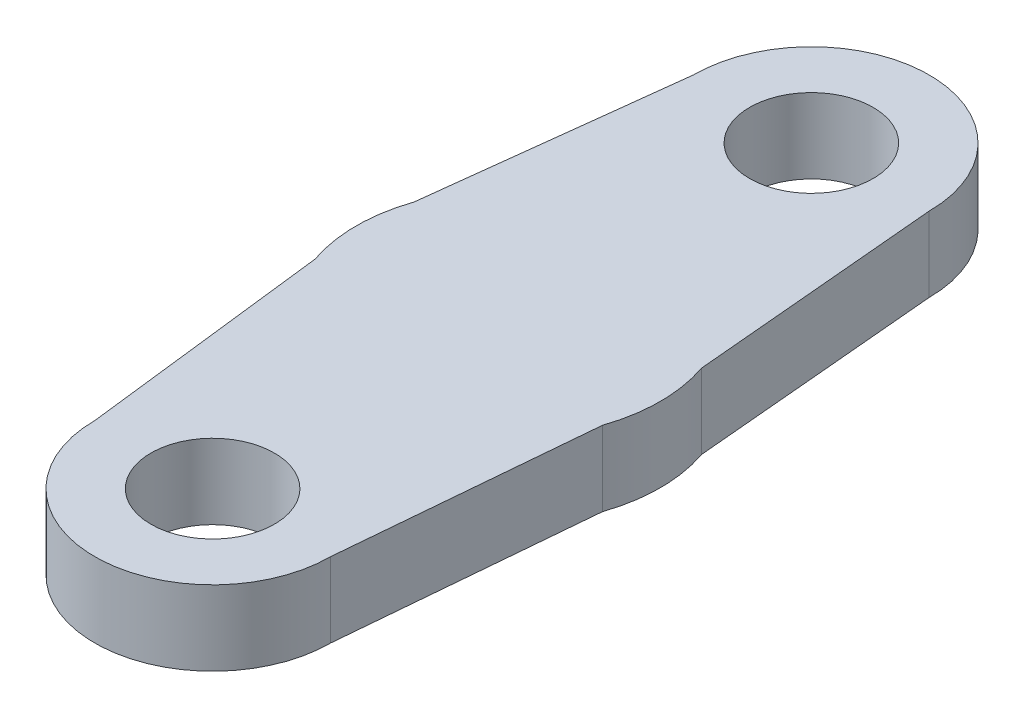
ISO-10303-21;
HEADER;
FILE_DESCRIPTION(('STEP AP214'),'2;1');
FILE_NAME('part.step','',(''),(''),'','','');
FILE_SCHEMA(('AUTOMOTIVE_DESIGN { 1 0 10303 214 1 1 1 1 }'));
ENDSEC;
DATA;
#1=APPLICATION_CONTEXT('core data for automotive mechanical design processes');
#2=APPLICATION_PROTOCOL_DEFINITION('international standard','automotive_design',2000,#1);
#3=PRODUCT_CONTEXT('',#1,'mechanical');
#4=PRODUCT('Part','Part','',(#3));
#5=PRODUCT_RELATED_PRODUCT_CATEGORY('part','',(#4));
#6=PRODUCT_DEFINITION_FORMATION('','',#4);
#7=PRODUCT_DEFINITION_CONTEXT('part definition',#1,'design');
#8=PRODUCT_DEFINITION('design','',#6,#7);
#9=PRODUCT_DEFINITION_SHAPE('','',#8);
#10=(LENGTH_UNIT() NAMED_UNIT(*) SI_UNIT(.MILLI.,.METRE.));
#11=(NAMED_UNIT(*) PLANE_ANGLE_UNIT() SI_UNIT($,.RADIAN.));
#12=(NAMED_UNIT(*) SI_UNIT($,.STERADIAN.) SOLID_ANGLE_UNIT());
#13=UNCERTAINTY_MEASURE_WITH_UNIT(LENGTH_MEASURE(1.E-05),#10,'distance_accuracy_value','');
#14=(GEOMETRIC_REPRESENTATION_CONTEXT(3) GLOBAL_UNCERTAINTY_ASSIGNED_CONTEXT((#13)) GLOBAL_UNIT_ASSIGNED_CONTEXT((#10,
#11,#12)) REPRESENTATION_CONTEXT('',''));
#15=CARTESIAN_POINT('',(0.,0.,0.));
#16=DIRECTION('',(0.,0.,1.));
#17=DIRECTION('',(1.,0.,0.));
#18=AXIS2_PLACEMENT_3D('',#15,#16,#17);
#19=CARTESIAN_POINT('',(0.,2.,0.));
#20=DIRECTION('',(0.,1.,0.));
#21=DIRECTION('',(0.,0.,1.));
#22=AXIS2_PLACEMENT_3D('',#19,#20,#21);
#23=PLANE('',#22);
#24=CARTESIAN_POINT('',(0.0999999999999985,2.,-8.00000000000001));
#25=DIRECTION('',(0.,1.,0.));
#26=DIRECTION('',(0.,0.,1.));
#27=AXIS2_PLACEMENT_3D('',#24,#25,#26);
#28=CIRCLE('',#27,1.65);
#29=CARTESIAN_POINT('',(0.0999999999999985,2.,-6.35000000000001));
#30=VERTEX_POINT('',#29);
#31=EDGE_CURVE('E134',#30,#30,#28,.T.);
#32=ORIENTED_EDGE('',*,*,#31,.F.);
#33=EDGE_LOOP('',(#32));
#34=FACE_BOUND('',#33,.T.);
#35=CARTESIAN_POINT('',(0.,2.,0.));
#36=DIRECTION('',(0.,1.,0.));
#37=DIRECTION('',(0.,0.,1.));
#38=AXIS2_PLACEMENT_3D('',#35,#36,#37);
#39=CIRCLE('',#38,4.06381800776111);
#40=CARTESIAN_POINT('',(3.84313688150053,2.,1.32095257683761));
#41=VERTEX_POINT('',#40);
#42=CARTESIAN_POINT('',(3.84313688150052,2.,-1.32095257683762));
#43=VERTEX_POINT('',#42);
#44=EDGE_CURVE('E145',#41,#43,#39,.T.);
#45=ORIENTED_EDGE('',*,*,#44,.T.);
#46=DIRECTION('',(-0.0884574879667481,0.,-0.996079953027172));
#47=VECTOR('',#46,1.);
#48=CARTESIAN_POINT('',(3.25,2.,-8.00000000000001));
#49=LINE('',#48,#47);
#50=CARTESIAN_POINT('',(3.25,2.,-8.00000000000001));
#51=VERTEX_POINT('',#50);
#52=EDGE_CURVE('E93',#43,#51,#49,.T.);
#53=ORIENTED_EDGE('',*,*,#52,.T.);
#54=CARTESIAN_POINT('',(0.0999999999999985,2.,-8.00000000000001));
#55=DIRECTION('',(0.,1.,0.));
#56=DIRECTION('',(0.,0.,1.));
#57=AXIS2_PLACEMENT_3D('',#54,#55,#56);
#58=CIRCLE('',#57,3.15);
#59=CARTESIAN_POINT('',(-3.05,2.,-8.00000000000001));
#60=VERTEX_POINT('',#59);
#61=EDGE_CURVE('E160',#51,#60,#58,.T.);
#62=ORIENTED_EDGE('',*,*,#61,.T.);
#63=DIRECTION('',(-0.117921472154174,0.,0.99302292340358));
#64=VECTOR('',#63,1.);
#65=CARTESIAN_POINT('',(-3.05,2.,-8.00000000000001));
#66=LINE('',#65,#64);
#67=CARTESIAN_POINT('',(-3.84313688150053,2.,-1.32095257683761));
#68=VERTEX_POINT('',#67);
#69=EDGE_CURVE('E173',#60,#68,#66,.T.);
#70=ORIENTED_EDGE('',*,*,#69,.T.);
#71=CARTESIAN_POINT('',(0.,2.,0.));
#72=DIRECTION('',(0.,1.,0.));
#73=DIRECTION('',(0.,0.,1.));
#74=AXIS2_PLACEMENT_3D('',#71,#72,#73);
#75=CIRCLE('',#74,4.06381800776111);
#76=CARTESIAN_POINT('',(-3.84313688150052,2.,1.32095257683761));
#77=VERTEX_POINT('',#76);
#78=EDGE_CURVE('E112',#68,#77,#75,.T.);
#79=ORIENTED_EDGE('',*,*,#78,.T.);
#80=DIRECTION('',(0.117921472154174,0.,0.99302292340358));
#81=VECTOR('',#80,1.);
#82=CARTESIAN_POINT('',(-3.84313688150052,2.,1.32095257683761));
#83=LINE('',#82,#81);
#84=CARTESIAN_POINT('',(-3.05,2.,8.00000000000001));
#85=VERTEX_POINT('',#84);
#86=EDGE_CURVE('E106',#77,#85,#83,.T.);
#87=ORIENTED_EDGE('',*,*,#86,.T.);
#88=CARTESIAN_POINT('',(0.0999999999999985,2.,8.00000000000001));
#89=DIRECTION('',(0.,1.,0.));
#90=DIRECTION('',(0.,0.,1.));
#91=AXIS2_PLACEMENT_3D('',#88,#89,#90);
#92=CIRCLE('',#91,3.15);
#93=CARTESIAN_POINT('',(3.25,2.,8.00000000000001));
#94=VERTEX_POINT('',#93);
#95=EDGE_CURVE('E110',#85,#94,#92,.T.);
#96=ORIENTED_EDGE('',*,*,#95,.T.);
#97=DIRECTION('',(0.0884574879667482,0.,-0.996079953027172));
#98=VECTOR('',#97,1.);
#99=CARTESIAN_POINT('',(3.84313688150053,2.,1.32095257683761));
#100=LINE('',#99,#98);
#101=EDGE_CURVE('E50',#94,#41,#100,.T.);
#102=ORIENTED_EDGE('',*,*,#101,.T.);
#103=EDGE_LOOP('',(#45,#53,#62,#70,#79,#87,#96,#102));
#104=FACE_BOUND('',#103,.T.);
#105=CARTESIAN_POINT('',(0.0999999999999985,2.,8.00000000000001));
#106=DIRECTION('',(0.,1.,0.));
#107=DIRECTION('',(0.,0.,1.));
#108=AXIS2_PLACEMENT_3D('',#105,#106,#107);
#109=CIRCLE('',#108,1.65);
#110=CARTESIAN_POINT('',(0.0999999999999985,2.,9.65000000000001));
#111=VERTEX_POINT('',#110);
#112=EDGE_CURVE('E182',#111,#111,#109,.T.);
#113=ORIENTED_EDGE('',*,*,#112,.F.);
#114=EDGE_LOOP('',(#113));
#115=FACE_BOUND('',#114,.T.);
#116=ADVANCED_FACE('F33',(#34,#104,#115),#23,.T.);
#117=CARTESIAN_POINT('',(0.,0.,0.));
#118=DIRECTION('',(0.,1.,0.));
#119=DIRECTION('',(0.,0.,1.));
#120=AXIS2_PLACEMENT_3D('',#117,#118,#119);
#121=PLANE('',#120);
#122=CARTESIAN_POINT('',(0.,0.,0.));
#123=DIRECTION('',(0.,1.,0.));
#124=DIRECTION('',(0.,0.,1.));
#125=AXIS2_PLACEMENT_3D('',#122,#123,#124);
#126=CIRCLE('',#125,4.06381800776111);
#127=CARTESIAN_POINT('',(3.84313688150053,0.,1.32095257683761));
#128=VERTEX_POINT('',#127);
#129=CARTESIAN_POINT('',(3.84313688150052,0.,-1.32095257683762));
#130=VERTEX_POINT('',#129);
#131=EDGE_CURVE('E130',#128,#130,#126,.T.);
#132=ORIENTED_EDGE('',*,*,#131,.F.);
#133=DIRECTION('',(0.0884574879667482,0.,-0.996079953027172));
#134=VECTOR('',#133,1.);
#135=CARTESIAN_POINT('',(3.84313688150053,0.,1.32095257683761));
#136=LINE('',#135,#134);
#137=CARTESIAN_POINT('',(3.25,0.,8.00000000000001));
#138=VERTEX_POINT('',#137);
#139=EDGE_CURVE('E85',#138,#128,#136,.T.);
#140=ORIENTED_EDGE('',*,*,#139,.F.);
#141=CARTESIAN_POINT('',(0.0999999999999985,0.,8.00000000000001));
#142=DIRECTION('',(0.,1.,0.));
#143=DIRECTION('',(0.,0.,1.));
#144=AXIS2_PLACEMENT_3D('',#141,#142,#143);
#145=CIRCLE('',#144,3.15);
#146=CARTESIAN_POINT('',(-3.05,0.,8.00000000000001));
#147=VERTEX_POINT('',#146);
#148=EDGE_CURVE('E79',#147,#138,#145,.T.);
#149=ORIENTED_EDGE('',*,*,#148,.F.);
#150=DIRECTION('',(0.117921472154174,0.,0.99302292340358));
#151=VECTOR('',#150,1.);
#152=CARTESIAN_POINT('',(-3.84313688150052,0.,1.32095257683761));
#153=LINE('',#152,#151);
#154=CARTESIAN_POINT('',(-3.84313688150052,0.,1.32095257683761));
#155=VERTEX_POINT('',#154);
#156=EDGE_CURVE('E120',#155,#147,#153,.T.);
#157=ORIENTED_EDGE('',*,*,#156,.F.);
#158=CARTESIAN_POINT('',(0.,0.,0.));
#159=DIRECTION('',(0.,1.,0.));
#160=DIRECTION('',(0.,0.,1.));
#161=AXIS2_PLACEMENT_3D('',#158,#159,#160);
#162=CIRCLE('',#161,4.06381800776111);
#163=CARTESIAN_POINT('',(-3.84313688150053,0.,-1.32095257683761));
#164=VERTEX_POINT('',#163);
#165=EDGE_CURVE('E140',#164,#155,#162,.T.);
#166=ORIENTED_EDGE('',*,*,#165,.F.);
#167=DIRECTION('',(-0.117921472154174,0.,0.99302292340358));
#168=VECTOR('',#167,1.);
#169=CARTESIAN_POINT('',(-3.05,0.,-8.00000000000001));
#170=LINE('',#169,#168);
#171=CARTESIAN_POINT('',(-3.05,0.,-8.00000000000001));
#172=VERTEX_POINT('',#171);
#173=EDGE_CURVE('E138',#172,#164,#170,.T.);
#174=ORIENTED_EDGE('',*,*,#173,.F.);
#175=CARTESIAN_POINT('',(0.0999999999999985,0.,-8.00000000000001));
#176=DIRECTION('',(0.,1.,0.));
#177=DIRECTION('',(0.,0.,1.));
#178=AXIS2_PLACEMENT_3D('',#175,#176,#177);
#179=CIRCLE('',#178,3.15);
#180=CARTESIAN_POINT('',(3.25,0.,-8.00000000000001));
#181=VERTEX_POINT('',#180);
#182=EDGE_CURVE('E136',#181,#172,#179,.T.);
#183=ORIENTED_EDGE('',*,*,#182,.F.);
#184=DIRECTION('',(-0.0884574879667481,0.,-0.996079953027172));
#185=VECTOR('',#184,1.);
#186=CARTESIAN_POINT('',(3.25,0.,-8.00000000000001));
#187=LINE('',#186,#185);
#188=EDGE_CURVE('E133',#130,#181,#187,.T.);
#189=ORIENTED_EDGE('',*,*,#188,.F.);
#190=EDGE_LOOP('',(#132,#140,#149,#157,#166,#174,#183,#189));
#191=FACE_BOUND('',#190,.T.);
#192=CARTESIAN_POINT('',(0.0999999999999985,0.,-8.00000000000001));
#193=DIRECTION('',(0.,1.,0.));
#194=DIRECTION('',(0.,0.,1.));
#195=AXIS2_PLACEMENT_3D('',#192,#193,#194);
#196=CIRCLE('',#195,1.65);
#197=CARTESIAN_POINT('',(0.0999999999999985,0.,-6.35000000000001));
#198=VERTEX_POINT('',#197);
#199=EDGE_CURVE('E179',#198,#198,#196,.T.);
#200=ORIENTED_EDGE('',*,*,#199,.T.);
#201=EDGE_LOOP('',(#200));
#202=FACE_BOUND('',#201,.T.);
#203=CARTESIAN_POINT('',(0.0999999999999985,0.,8.00000000000001));
#204=DIRECTION('',(0.,1.,0.));
#205=DIRECTION('',(0.,0.,1.));
#206=AXIS2_PLACEMENT_3D('',#203,#204,#205);
#207=CIRCLE('',#206,1.65);
#208=CARTESIAN_POINT('',(0.0999999999999985,0.,9.65000000000001));
#209=VERTEX_POINT('',#208);
#210=EDGE_CURVE('E185',#209,#209,#207,.T.);
#211=ORIENTED_EDGE('',*,*,#210,.T.);
#212=EDGE_LOOP('',(#211));
#213=FACE_BOUND('',#212,.T.);
#214=ADVANCED_FACE('F164',(#191,#202,#213),#121,.F.);
#215=CARTESIAN_POINT('',(0.,2.,0.));
#216=DIRECTION('',(0.,-1.,0.));
#217=DIRECTION('',(0.,0.,-1.));
#218=AXIS2_PLACEMENT_3D('',#215,#216,#217);
#219=CYLINDRICAL_SURFACE('',#218,4.06381800776111);
#220=ORIENTED_EDGE('',*,*,#131,.T.);
#221=DIRECTION('',(0.,-1.,0.));
#222=VECTOR('',#221,1.);
#223=CARTESIAN_POINT('',(3.84313688150052,2.,-1.32095257683762));
#224=LINE('',#223,#222);
#225=EDGE_CURVE('E11',#43,#130,#224,.T.);
#226=ORIENTED_EDGE('',*,*,#225,.F.);
#227=ORIENTED_EDGE('',*,*,#44,.F.);
#228=DIRECTION('',(0.,-1.,0.));
#229=VECTOR('',#228,1.);
#230=CARTESIAN_POINT('',(3.84313688150053,2.,1.32095257683761));
#231=LINE('',#230,#229);
#232=EDGE_CURVE('E126',#41,#128,#231,.T.);
#233=ORIENTED_EDGE('',*,*,#232,.T.);
#234=EDGE_LOOP('',(#220,#226,#227,#233));
#235=FACE_BOUND('',#234,.T.);
#236=ADVANCED_FACE('F35',(#235),#219,.T.);
#237=CARTESIAN_POINT('',(3.25,2.,-8.00000000000001));
#238=DIRECTION('',(-0.996079953027172,0.,0.0884574879667481));
#239=DIRECTION('',(0.0884574879667481,0.,0.996079953027172));
#240=AXIS2_PLACEMENT_3D('',#237,#238,#239);
#241=PLANE('',#240);
#242=ORIENTED_EDGE('',*,*,#188,.T.);
#243=DIRECTION('',(0.,-1.,0.));
#244=VECTOR('',#243,1.);
#245=CARTESIAN_POINT('',(3.25,2.,-8.00000000000001));
#246=LINE('',#245,#244);
#247=EDGE_CURVE('E42',#51,#181,#246,.T.);
#248=ORIENTED_EDGE('',*,*,#247,.F.);
#249=ORIENTED_EDGE('',*,*,#52,.F.);
#250=ORIENTED_EDGE('',*,*,#225,.T.);
#251=EDGE_LOOP('',(#242,#248,#249,#250));
#252=FACE_BOUND('',#251,.T.);
#253=ADVANCED_FACE('F217',(#252),#241,.F.);
#254=CARTESIAN_POINT('',(0.0999999999999985,2.,-8.00000000000001));
#255=DIRECTION('',(0.,-1.,0.));
#256=DIRECTION('',(0.,0.,-1.));
#257=AXIS2_PLACEMENT_3D('',#254,#255,#256);
#258=CYLINDRICAL_SURFACE('',#257,3.15);
#259=ORIENTED_EDGE('',*,*,#182,.T.);
#260=DIRECTION('',(0.,-1.,0.));
#261=VECTOR('',#260,1.);
#262=CARTESIAN_POINT('',(-3.05,2.,-8.00000000000001));
#263=LINE('',#262,#261);
#264=EDGE_CURVE('E152',#60,#172,#263,.T.);
#265=ORIENTED_EDGE('',*,*,#264,.F.);
#266=ORIENTED_EDGE('',*,*,#61,.F.);
#267=ORIENTED_EDGE('',*,*,#247,.T.);
#268=EDGE_LOOP('',(#259,#265,#266,#267));
#269=FACE_BOUND('',#268,.T.);
#270=ADVANCED_FACE('F158',(#269),#258,.T.);
#271=CARTESIAN_POINT('',(-3.05,2.,-8.00000000000001));
#272=DIRECTION('',(0.99302292340358,0.,0.117921472154174));
#273=DIRECTION('',(0.117921472154174,0.,-0.99302292340358));
#274=AXIS2_PLACEMENT_3D('',#271,#272,#273);
#275=PLANE('',#274);
#276=ORIENTED_EDGE('',*,*,#173,.T.);
#277=DIRECTION('',(0.,-1.,0.));
#278=VECTOR('',#277,1.);
#279=CARTESIAN_POINT('',(-3.84313688150053,2.,-1.32095257683761));
#280=LINE('',#279,#278);
#281=EDGE_CURVE('E149',#68,#164,#280,.T.);
#282=ORIENTED_EDGE('',*,*,#281,.F.);
#283=ORIENTED_EDGE('',*,*,#69,.F.);
#284=ORIENTED_EDGE('',*,*,#264,.T.);
#285=EDGE_LOOP('',(#276,#282,#283,#284));
#286=FACE_BOUND('',#285,.T.);
#287=ADVANCED_FACE('F169',(#286),#275,.F.);
#288=CARTESIAN_POINT('',(0.,2.,0.));
#289=DIRECTION('',(0.,-1.,0.));
#290=DIRECTION('',(0.,0.,-1.));
#291=AXIS2_PLACEMENT_3D('',#288,#289,#290);
#292=CYLINDRICAL_SURFACE('',#291,4.06381800776111);
#293=ORIENTED_EDGE('',*,*,#165,.T.);
#294=DIRECTION('',(0.,-1.,0.));
#295=VECTOR('',#294,1.);
#296=CARTESIAN_POINT('',(-3.84313688150052,2.,1.32095257683761));
#297=LINE('',#296,#295);
#298=EDGE_CURVE('E121',#77,#155,#297,.T.);
#299=ORIENTED_EDGE('',*,*,#298,.F.);
#300=ORIENTED_EDGE('',*,*,#78,.F.);
#301=ORIENTED_EDGE('',*,*,#281,.T.);
#302=EDGE_LOOP('',(#293,#299,#300,#301));
#303=FACE_BOUND('',#302,.T.);
#304=ADVANCED_FACE('F172',(#303),#292,.T.);
#305=CARTESIAN_POINT('',(-3.84313688150052,2.,1.32095257683761));
#306=DIRECTION('',(0.99302292340358,0.,-0.117921472154174));
#307=DIRECTION('',(-0.117921472154174,0.,-0.99302292340358));
#308=AXIS2_PLACEMENT_3D('',#305,#306,#307);
#309=PLANE('',#308);
#310=ORIENTED_EDGE('',*,*,#156,.T.);
#311=DIRECTION('',(0.,-1.,0.));
#312=VECTOR('',#311,1.);
#313=CARTESIAN_POINT('',(-3.05,2.,8.00000000000001));
#314=LINE('',#313,#312);
#315=EDGE_CURVE('E117',#85,#147,#314,.T.);
#316=ORIENTED_EDGE('',*,*,#315,.F.);
#317=ORIENTED_EDGE('',*,*,#86,.F.);
#318=ORIENTED_EDGE('',*,*,#298,.T.);
#319=EDGE_LOOP('',(#310,#316,#317,#318));
#320=FACE_BOUND('',#319,.T.);
#321=ADVANCED_FACE('F118',(#320),#309,.F.);
#322=CARTESIAN_POINT('',(0.0999999999999985,2.,8.00000000000001));
#323=DIRECTION('',(0.,-1.,0.));
#324=DIRECTION('',(0.,0.,-1.));
#325=AXIS2_PLACEMENT_3D('',#322,#323,#324);
#326=CYLINDRICAL_SURFACE('',#325,3.15);
#327=ORIENTED_EDGE('',*,*,#148,.T.);
#328=DIRECTION('',(0.,-1.,0.));
#329=VECTOR('',#328,1.);
#330=CARTESIAN_POINT('',(3.25,2.,8.00000000000001));
#331=LINE('',#330,#329);
#332=EDGE_CURVE('E122',#94,#138,#331,.T.);
#333=ORIENTED_EDGE('',*,*,#332,.F.);
#334=ORIENTED_EDGE('',*,*,#95,.F.);
#335=ORIENTED_EDGE('',*,*,#315,.T.);
#336=EDGE_LOOP('',(#327,#333,#334,#335));
#337=FACE_BOUND('',#336,.T.);
#338=ADVANCED_FACE('F124',(#337),#326,.T.);
#339=CARTESIAN_POINT('',(3.84313688150053,2.,1.32095257683761));
#340=DIRECTION('',(-0.996079953027172,0.,-0.0884574879667482));
#341=DIRECTION('',(-0.0884574879667482,0.,0.996079953027172));
#342=AXIS2_PLACEMENT_3D('',#339,#340,#341);
#343=PLANE('',#342);
#344=ORIENTED_EDGE('',*,*,#139,.T.);
#345=ORIENTED_EDGE('',*,*,#232,.F.);
#346=ORIENTED_EDGE('',*,*,#101,.F.);
#347=ORIENTED_EDGE('',*,*,#332,.T.);
#348=EDGE_LOOP('',(#344,#345,#346,#347));
#349=FACE_BOUND('',#348,.T.);
#350=ADVANCED_FACE('F205',(#349),#343,.F.);
#351=CARTESIAN_POINT('',(0.0999999999999985,2.,-8.00000000000001));
#352=DIRECTION('',(0.,-1.,0.));
#353=DIRECTION('',(0.,0.,-1.));
#354=AXIS2_PLACEMENT_3D('',#351,#352,#353);
#355=CYLINDRICAL_SURFACE('',#354,1.65);
#356=ORIENTED_EDGE('',*,*,#31,.T.);
#357=EDGE_LOOP('',(#356));
#358=FACE_BOUND('',#357,.T.);
#359=ORIENTED_EDGE('',*,*,#199,.F.);
#360=EDGE_LOOP('',(#359));
#361=FACE_BOUND('',#360,.T.);
#362=ADVANCED_FACE('F202',(#358,#361),#355,.F.);
#363=CARTESIAN_POINT('',(0.0999999999999985,2.,8.00000000000001));
#364=DIRECTION('',(0.,-1.,0.));
#365=DIRECTION('',(0.,0.,-1.));
#366=AXIS2_PLACEMENT_3D('',#363,#364,#365);
#367=CYLINDRICAL_SURFACE('',#366,1.65);
#368=ORIENTED_EDGE('',*,*,#112,.T.);
#369=EDGE_LOOP('',(#368));
#370=FACE_BOUND('',#369,.T.);
#371=ORIENTED_EDGE('',*,*,#210,.F.);
#372=EDGE_LOOP('',(#371));
#373=FACE_BOUND('',#372,.T.);
#374=ADVANCED_FACE('F191',(#370,#373),#367,.F.);
#375=CLOSED_SHELL('',(#116,#214,#236,#253,#270,#287,#304,#321,#338,#350,#362,#374));
#376=MANIFOLD_SOLID_BREP('B2',#375);
#377=ADVANCED_BREP_SHAPE_REPRESENTATION('',(#18,#376),#14);
#378=SHAPE_DEFINITION_REPRESENTATION(#9,#377);
ENDSEC;
END-ISO-10303-21;
